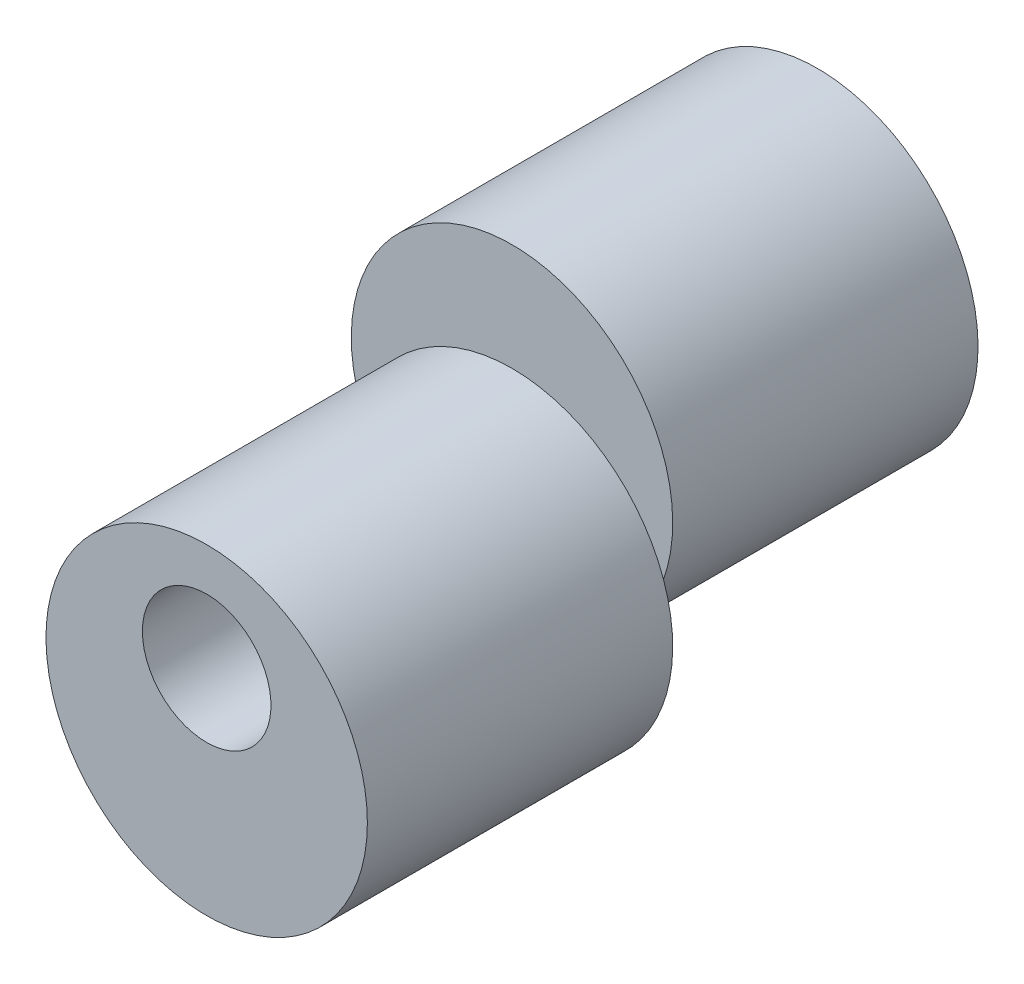
ISO-10303-21;
HEADER;
FILE_DESCRIPTION(('STEP AP214'),'2;1');
FILE_NAME('part.step','',(''),(''),'','','');
FILE_SCHEMA(('AUTOMOTIVE_DESIGN { 1 0 10303 214 1 1 1 1 }'));
ENDSEC;
DATA;
#1=APPLICATION_CONTEXT('core data for automotive mechanical design processes');
#2=APPLICATION_PROTOCOL_DEFINITION('international standard','automotive_design',2000,#1);
#3=PRODUCT_CONTEXT('',#1,'mechanical');
#4=PRODUCT('Part','Part','',(#3));
#5=PRODUCT_RELATED_PRODUCT_CATEGORY('part','',(#4));
#6=PRODUCT_DEFINITION_FORMATION('','',#4);
#7=PRODUCT_DEFINITION_CONTEXT('part definition',#1,'design');
#8=PRODUCT_DEFINITION('design','',#6,#7);
#9=PRODUCT_DEFINITION_SHAPE('','',#8);
#10=(LENGTH_UNIT() NAMED_UNIT(*) SI_UNIT(.MILLI.,.METRE.));
#11=(NAMED_UNIT(*) PLANE_ANGLE_UNIT() SI_UNIT($,.RADIAN.));
#12=(NAMED_UNIT(*) SI_UNIT($,.STERADIAN.) SOLID_ANGLE_UNIT());
#13=UNCERTAINTY_MEASURE_WITH_UNIT(LENGTH_MEASURE(1.E-05),#10,'distance_accuracy_value','');
#14=(GEOMETRIC_REPRESENTATION_CONTEXT(3) GLOBAL_UNCERTAINTY_ASSIGNED_CONTEXT((#13)) GLOBAL_UNIT_ASSIGNED_CONTEXT((#10,
#11,#12)) REPRESENTATION_CONTEXT('',''));
#15=CARTESIAN_POINT('',(0.,0.,0.));
#16=DIRECTION('',(0.,0.,1.));
#17=DIRECTION('',(1.,0.,0.));
#18=AXIS2_PLACEMENT_3D('',#15,#16,#17);
#19=CARTESIAN_POINT('',(0.,-2.5,14.25));
#20=DIRECTION('',(0.,0.,-1.));
#21=DIRECTION('',(-1.,0.,0.));
#22=AXIS2_PLACEMENT_3D('',#19,#20,#21);
#23=CYLINDRICAL_SURFACE('',#22,7.5);
#24=CARTESIAN_POINT('',(0.,-2.5,14.25));
#25=DIRECTION('',(0.,0.,1.));
#26=DIRECTION('',(1.,0.,0.));
#27=AXIS2_PLACEMENT_3D('',#24,#25,#26);
#28=CIRCLE('',#27,7.5);
#29=CARTESIAN_POINT('',(7.5,-2.5,14.25));
#30=VERTEX_POINT('',#29);
#31=EDGE_CURVE('E11',#30,#30,#28,.T.);
#32=ORIENTED_EDGE('',*,*,#31,.F.);
#33=EDGE_LOOP('',(#32));
#34=FACE_BOUND('',#33,.T.);
#35=CARTESIAN_POINT('',(0.,-2.5,0.));
#36=DIRECTION('',(0.,0.,1.));
#37=DIRECTION('',(1.,0.,0.));
#38=AXIS2_PLACEMENT_3D('',#35,#36,#37);
#39=CIRCLE('',#38,7.5);
#40=CARTESIAN_POINT('',(7.07106781186547,0.,0.));
#41=VERTEX_POINT('',#40);
#42=CARTESIAN_POINT('',(-7.07106781186547,0.,0.));
#43=VERTEX_POINT('',#42);
#44=EDGE_CURVE('E39',#41,#43,#39,.T.);
#45=ORIENTED_EDGE('',*,*,#44,.T.);
#46=EDGE_CURVE('E54',#43,#41,#39,.T.);
#47=ORIENTED_EDGE('',*,*,#46,.T.);
#48=EDGE_LOOP('',(#45,#47));
#49=FACE_BOUND('',#48,.T.);
#50=ADVANCED_FACE('F36',(#34,#49),#23,.T.);
#51=CARTESIAN_POINT('',(0.,-2.5,14.25));
#52=DIRECTION('',(0.,0.,1.));
#53=DIRECTION('',(1.,0.,0.));
#54=AXIS2_PLACEMENT_3D('',#51,#52,#53);
#55=PLANE('',#54);
#56=CARTESIAN_POINT('',(0.,-1.2161090996209E-13,14.25));
#57=DIRECTION('',(0.,0.,-1.));
#58=DIRECTION('',(-1.,0.,0.));
#59=AXIS2_PLACEMENT_3D('',#56,#57,#58);
#60=CIRCLE('',#59,3.00000000000004);
#61=CARTESIAN_POINT('',(-3.00000000000004,-1.2161090996209E-13,14.25));
#62=VERTEX_POINT('',#61);
#63=EDGE_CURVE('E63',#62,#62,#60,.T.);
#64=ORIENTED_EDGE('',*,*,#63,.T.);
#65=EDGE_LOOP('',(#64));
#66=FACE_BOUND('',#65,.T.);
#67=ORIENTED_EDGE('',*,*,#31,.T.);
#68=EDGE_LOOP('',(#67));
#69=FACE_BOUND('',#68,.T.);
#70=ADVANCED_FACE('F75',(#66,#69),#55,.T.);
#71=CARTESIAN_POINT('',(0.,-2.5,0.));
#72=DIRECTION('',(0.,0.,1.));
#73=DIRECTION('',(1.,0.,0.));
#74=AXIS2_PLACEMENT_3D('',#71,#72,#73);
#75=PLANE('',#74);
#76=CARTESIAN_POINT('',(0.,2.5,0.));
#77=DIRECTION('',(0.,0.,-1.));
#78=DIRECTION('',(-1.,0.,0.));
#79=AXIS2_PLACEMENT_3D('',#76,#77,#78);
#80=CIRCLE('',#79,7.5);
#81=EDGE_CURVE('E49',#41,#43,#80,.T.);
#82=ORIENTED_EDGE('',*,*,#81,.F.);
#83=ORIENTED_EDGE('',*,*,#46,.F.);
#84=EDGE_LOOP('',(#82,#83));
#85=FACE_BOUND('',#84,.T.);
#86=ADVANCED_FACE('F58',(#85),#75,.F.);
#87=CARTESIAN_POINT('',(0.,2.5,-14.25));
#88=DIRECTION('',(0.,0.,1.));
#89=DIRECTION('',(1.,0.,0.));
#90=AXIS2_PLACEMENT_3D('',#87,#88,#89);
#91=CYLINDRICAL_SURFACE('',#90,7.5);
#92=CARTESIAN_POINT('',(0.,2.5,-14.25));
#93=DIRECTION('',(0.,0.,-1.));
#94=DIRECTION('',(-1.,0.,0.));
#95=AXIS2_PLACEMENT_3D('',#92,#93,#94);
#96=CIRCLE('',#95,7.5);
#97=CARTESIAN_POINT('',(-7.5,2.5,-14.25));
#98=VERTEX_POINT('',#97);
#99=EDGE_CURVE('E59',#98,#98,#96,.T.);
#100=ORIENTED_EDGE('',*,*,#99,.F.);
#101=EDGE_LOOP('',(#100));
#102=FACE_BOUND('',#101,.T.);
#103=ORIENTED_EDGE('',*,*,#81,.T.);
#104=EDGE_CURVE('E60',#43,#41,#80,.T.);
#105=ORIENTED_EDGE('',*,*,#104,.T.);
#106=EDGE_LOOP('',(#103,#105));
#107=FACE_BOUND('',#106,.T.);
#108=ADVANCED_FACE('F65',(#102,#107),#91,.T.);
#109=CARTESIAN_POINT('',(0.,2.5,-14.25));
#110=DIRECTION('',(0.,0.,-1.));
#111=DIRECTION('',(-1.,0.,0.));
#112=AXIS2_PLACEMENT_3D('',#109,#110,#111);
#113=PLANE('',#112);
#114=CARTESIAN_POINT('',(0.,-1.2161090996209E-13,-14.25));
#115=DIRECTION('',(0.,0.,-1.));
#116=DIRECTION('',(-1.,0.,0.));
#117=AXIS2_PLACEMENT_3D('',#114,#115,#116);
#118=CIRCLE('',#117,3.00000000000004);
#119=CARTESIAN_POINT('',(-3.00000000000004,-1.2161090996209E-13,-14.25));
#120=VERTEX_POINT('',#119);
#121=EDGE_CURVE('E69',#120,#120,#118,.T.);
#122=ORIENTED_EDGE('',*,*,#121,.F.);
#123=EDGE_LOOP('',(#122));
#124=FACE_BOUND('',#123,.T.);
#125=ORIENTED_EDGE('',*,*,#99,.T.);
#126=EDGE_LOOP('',(#125));
#127=FACE_BOUND('',#126,.T.);
#128=ADVANCED_FACE('F84',(#124,#127),#113,.T.);
#129=CARTESIAN_POINT('',(0.,2.5,0.));
#130=DIRECTION('',(0.,0.,-1.));
#131=DIRECTION('',(-1.,0.,0.));
#132=AXIS2_PLACEMENT_3D('',#129,#130,#131);
#133=PLANE('',#132);
#134=ORIENTED_EDGE('',*,*,#44,.F.);
#135=ORIENTED_EDGE('',*,*,#104,.F.);
#136=EDGE_LOOP('',(#134,#135));
#137=FACE_BOUND('',#136,.T.);
#138=ADVANCED_FACE('F61',(#137),#133,.F.);
#139=CARTESIAN_POINT('',(0.,-1.2161090996209E-13,14.25));
#140=DIRECTION('',(0.,0.,-1.));
#141=DIRECTION('',(-1.,0.,0.));
#142=AXIS2_PLACEMENT_3D('',#139,#140,#141);
#143=CYLINDRICAL_SURFACE('',#142,3.00000000000004);
#144=CARTESIAN_POINT('',(-3.00000000000004,-1.2161090996209E-13,14.25));
#145=CARTESIAN_POINT('',(-3.00000000000004,-1.2161090996209E-13,13.953125));
#146=CARTESIAN_POINT('',(-3.00000000000004,-1.2161090996209E-13,13.65625));
#147=CARTESIAN_POINT('',(-3.00000000000004,-1.2161090996209E-13,13.0625));
#148=CARTESIAN_POINT('',(-3.00000000000004,-1.2161090996209E-13,12.765625));
#149=CARTESIAN_POINT('',(-3.00000000000004,-1.2161090996209E-13,12.171875));
#150=CARTESIAN_POINT('',(-3.00000000000004,-1.2161090996209E-13,11.875));
#151=CARTESIAN_POINT('',(-3.00000000000004,-1.2161090996209E-13,11.28125));
#152=CARTESIAN_POINT('',(-3.00000000000004,-1.2161090996209E-13,10.984375));
#153=CARTESIAN_POINT('',(-3.00000000000004,-1.2161090996209E-13,10.390625));
#154=CARTESIAN_POINT('',(-3.00000000000004,-1.2161090996209E-13,10.09375));
#155=CARTESIAN_POINT('',(-3.00000000000004,-1.2161090996209E-13,9.5));
#156=CARTESIAN_POINT('',(-3.00000000000004,-1.2161090996209E-13,9.203125));
#157=CARTESIAN_POINT('',(-3.00000000000004,-1.2161090996209E-13,8.609375));
#158=CARTESIAN_POINT('',(-3.00000000000004,-1.2161090996209E-13,8.3125));
#159=CARTESIAN_POINT('',(-3.00000000000004,-1.2161090996209E-13,7.71875));
#160=CARTESIAN_POINT('',(-3.00000000000004,-1.2161090996209E-13,7.421875));
#161=CARTESIAN_POINT('',(-3.00000000000004,-1.2161090996209E-13,6.828125));
#162=CARTESIAN_POINT('',(-3.00000000000004,-1.2161090996209E-13,6.53125));
#163=CARTESIAN_POINT('',(-3.00000000000004,-1.2161090996209E-13,5.9375));
#164=CARTESIAN_POINT('',(-3.00000000000004,-1.2161090996209E-13,5.640625));
#165=CARTESIAN_POINT('',(-3.00000000000004,-1.2161090996209E-13,5.046875));
#166=CARTESIAN_POINT('',(-3.00000000000004,-1.2161090996209E-13,4.75));
#167=CARTESIAN_POINT('',(-3.00000000000004,-1.2161090996209E-13,4.15625));
#168=CARTESIAN_POINT('',(-3.00000000000004,-1.2161090996209E-13,3.859375));
#169=CARTESIAN_POINT('',(-3.00000000000004,-1.2161090996209E-13,3.265625));
#170=CARTESIAN_POINT('',(-3.00000000000004,-1.2161090996209E-13,2.96875));
#171=CARTESIAN_POINT('',(-3.00000000000004,-1.2161090996209E-13,2.375));
#172=CARTESIAN_POINT('',(-3.00000000000004,-1.2161090996209E-13,2.078125));
#173=CARTESIAN_POINT('',(-3.00000000000004,-1.2161090996209E-13,1.484375));
#174=CARTESIAN_POINT('',(-3.00000000000004,-1.2161090996209E-13,1.1875));
#175=CARTESIAN_POINT('',(-3.00000000000004,-1.2161090996209E-13,0.593750000000002));
#176=CARTESIAN_POINT('',(-3.00000000000004,-1.2161090996209E-13,0.296875000000002));
#177=CARTESIAN_POINT('',(-3.00000000000004,-1.2161090996209E-13,-0.296874999999999));
#178=CARTESIAN_POINT('',(-3.00000000000004,-1.2161090996209E-13,-0.593749999999999));
#179=CARTESIAN_POINT('',(-3.00000000000004,-1.2161090996209E-13,-1.1875));
#180=CARTESIAN_POINT('',(-3.00000000000004,-1.2161090996209E-13,-1.484375));
#181=CARTESIAN_POINT('',(-3.00000000000004,-1.2161090996209E-13,-2.078125));
#182=CARTESIAN_POINT('',(-3.00000000000004,-1.2161090996209E-13,-2.375));
#183=CARTESIAN_POINT('',(-3.00000000000004,-1.2161090996209E-13,-2.96875));
#184=CARTESIAN_POINT('',(-3.00000000000004,-1.2161090996209E-13,-3.265625));
#185=CARTESIAN_POINT('',(-3.00000000000004,-1.2161090996209E-13,-3.859375));
#186=CARTESIAN_POINT('',(-3.00000000000004,-1.2161090996209E-13,-4.15625));
#187=CARTESIAN_POINT('',(-3.00000000000004,-1.2161090996209E-13,-4.75));
#188=CARTESIAN_POINT('',(-3.00000000000004,-1.2161090996209E-13,-5.046875));
#189=CARTESIAN_POINT('',(-3.00000000000004,-1.2161090996209E-13,-5.640625));
#190=CARTESIAN_POINT('',(-3.00000000000004,-1.2161090996209E-13,-5.9375));
#191=CARTESIAN_POINT('',(-3.00000000000004,-1.2161090996209E-13,-6.53125));
#192=CARTESIAN_POINT('',(-3.00000000000004,-1.2161090996209E-13,-6.828125));
#193=CARTESIAN_POINT('',(-3.00000000000004,-1.2161090996209E-13,-7.421875));
#194=CARTESIAN_POINT('',(-3.00000000000004,-1.2161090996209E-13,-7.71875));
#195=CARTESIAN_POINT('',(-3.00000000000004,-1.2161090996209E-13,-8.3125));
#196=CARTESIAN_POINT('',(-3.00000000000004,-1.2161090996209E-13,-8.609375));
#197=CARTESIAN_POINT('',(-3.00000000000004,-1.2161090996209E-13,-9.203125));
#198=CARTESIAN_POINT('',(-3.00000000000004,-1.2161090996209E-13,-9.5));
#199=CARTESIAN_POINT('',(-3.00000000000004,-1.2161090996209E-13,-10.09375));
#200=CARTESIAN_POINT('',(-3.00000000000004,-1.2161090996209E-13,-10.390625));
#201=CARTESIAN_POINT('',(-3.00000000000004,-1.2161090996209E-13,-10.984375));
#202=CARTESIAN_POINT('',(-3.00000000000004,-1.2161090996209E-13,-11.28125));
#203=CARTESIAN_POINT('',(-3.00000000000004,-1.2161090996209E-13,-11.875));
#204=CARTESIAN_POINT('',(-3.00000000000004,-1.2161090996209E-13,-12.171875));
#205=CARTESIAN_POINT('',(-3.00000000000004,-1.2161090996209E-13,-12.765625));
#206=CARTESIAN_POINT('',(-3.00000000000004,-1.2161090996209E-13,-13.0625));
#207=CARTESIAN_POINT('',(-3.00000000000004,-1.2161090996209E-13,-13.65625));
#208=CARTESIAN_POINT('',(-3.00000000000004,-1.2161090996209E-13,-13.953125));
#209=CARTESIAN_POINT('',(-3.00000000000004,-1.2161090996209E-13,-14.25));
#210=B_SPLINE_CURVE_WITH_KNOTS('',3,(#144,#145,#146,#147,#148,#149,#150,#151,#152,#153,#154,
#155,#156,#157,#158,#159,#160,#161,#162,#163,#164,#165,#166,#167,#168,#169,#170,#171,#172,#173,
#174,#175,#176,#177,#178,#179,#180,#181,#182,#183,#184,#185,#186,#187,#188,#189,#190,#191,#192,
#193,#194,#195,#196,#197,#198,#199,#200,#201,#202,#203,#204,#205,#206,#207,#208,#209),
.UNSPECIFIED.,.F.,.F.,(4,2,2,2,2,2,2,2,2,2,2,2,2,2,2,2,2,2,2,2,2,2,2,2,2,2,2,2,2,2,2,2,4),(0.,
0.890625000000001,1.78125,2.671875,3.5625,4.453125,5.34375,6.234375,7.125,8.015625,8.90625,
9.796875,10.6875,11.578125,12.46875,13.359375,14.25,15.140625,16.03125,16.921875,17.8125,
18.703125,19.59375,20.484375,21.375,22.265625,23.15625,24.046875,24.9375,25.828125,26.71875,
27.609375,28.5),.UNSPECIFIED.);
#211=EDGE_CURVE('BSEAM78',#62,#120,#210,.T.);
#212=ORIENTED_EDGE('',*,*,#63,.F.);
#213=ORIENTED_EDGE('',*,*,#121,.T.);
#214=ORIENTED_EDGE('',*,*,#211,.T.);
#215=ORIENTED_EDGE('',*,*,#211,.F.);
#216=EDGE_LOOP('',(#212,#214,#213,#215));
#217=FACE_BOUND('',#216,.T.);
#218=ADVANCED_FACE('F78',(#217),#143,.F.);
#219=CLOSED_SHELL('',(#50,#70,#86,#108,#128,#138,#218));
#220=MANIFOLD_SOLID_BREP('B2',#219);
#221=ADVANCED_BREP_SHAPE_REPRESENTATION('',(#18,#220),#14);
#222=SHAPE_DEFINITION_REPRESENTATION(#9,#221);
ENDSEC;
END-ISO-10303-21;
